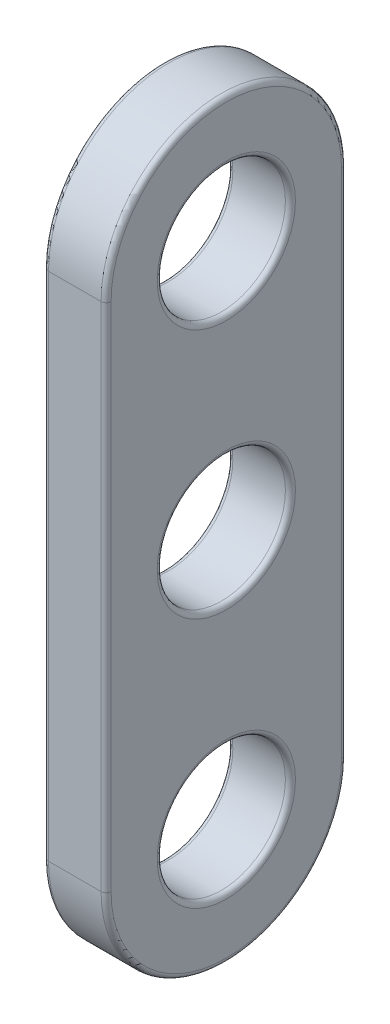
ISO-10303-21;
HEADER;
FILE_DESCRIPTION(('STEP AP214'),'2;1');
FILE_NAME('part.step','',(''),(''),'','','');
FILE_SCHEMA(('AUTOMOTIVE_DESIGN { 1 0 10303 214 1 1 1 1 }'));
ENDSEC;
DATA;
#1=APPLICATION_CONTEXT('core data for automotive mechanical design processes');
#2=APPLICATION_PROTOCOL_DEFINITION('international standard','automotive_design',2000,#1);
#3=PRODUCT_CONTEXT('',#1,'mechanical');
#4=PRODUCT('Part','Part','',(#3));
#5=PRODUCT_RELATED_PRODUCT_CATEGORY('part','',(#4));
#6=PRODUCT_DEFINITION_FORMATION('','',#4);
#7=PRODUCT_DEFINITION_CONTEXT('part definition',#1,'design');
#8=PRODUCT_DEFINITION('design','',#6,#7);
#9=PRODUCT_DEFINITION_SHAPE('','',#8);
#10=(LENGTH_UNIT() NAMED_UNIT(*) SI_UNIT(.MILLI.,.METRE.));
#11=(NAMED_UNIT(*) PLANE_ANGLE_UNIT() SI_UNIT($,.RADIAN.));
#12=(NAMED_UNIT(*) SI_UNIT($,.STERADIAN.) SOLID_ANGLE_UNIT());
#13=UNCERTAINTY_MEASURE_WITH_UNIT(LENGTH_MEASURE(1.E-05),#10,'distance_accuracy_value','');
#14=(GEOMETRIC_REPRESENTATION_CONTEXT(3) GLOBAL_UNCERTAINTY_ASSIGNED_CONTEXT((#13)) GLOBAL_UNIT_ASSIGNED_CONTEXT((#10,
#11,#12)) REPRESENTATION_CONTEXT('',''));
#15=CARTESIAN_POINT('',(0.,0.,0.));
#16=DIRECTION('',(0.,0.,1.));
#17=DIRECTION('',(1.,0.,0.));
#18=AXIS2_PLACEMENT_3D('',#15,#16,#17);
#19=CARTESIAN_POINT('',(-1.5875,-12.954,0.));
#20=DIRECTION('',(-1.,0.,0.));
#21=DIRECTION('',(0.,0.,1.));
#22=AXIS2_PLACEMENT_3D('',#19,#20,#21);
#23=CYLINDRICAL_SURFACE('',#22,6.096);
#24=DIRECTION('',(-1.,0.,0.));
#25=VECTOR('',#24,1.);
#26=CARTESIAN_POINT('',(1.5875,-12.954,6.096));
#27=LINE('',#26,#25);
#28=CARTESIAN_POINT('',(-1.3335,-12.954,6.096));
#29=VERTEX_POINT('',#28);
#30=CARTESIAN_POINT('',(1.3335,-12.954,6.096));
#31=VERTEX_POINT('',#30);
#32=EDGE_CURVE('E208',#29,#31,#27,.F.);
#33=ORIENTED_EDGE('',*,*,#32,.F.);
#34=CARTESIAN_POINT('',(-1.3335,-12.954,0.));
#35=DIRECTION('',(1.,0.,0.));
#36=DIRECTION('',(0.,0.,-1.));
#37=AXIS2_PLACEMENT_3D('',#34,#35,#36);
#38=CIRCLE('',#37,6.096);
#39=CARTESIAN_POINT('',(-1.3335,-12.954,-6.096));
#40=VERTEX_POINT('',#39);
#41=EDGE_CURVE('E179',#29,#40,#38,.T.);
#42=ORIENTED_EDGE('',*,*,#41,.T.);
#43=DIRECTION('',(-1.,0.,0.));
#44=VECTOR('',#43,1.);
#45=CARTESIAN_POINT('',(1.5875,-12.954,-6.096));
#46=LINE('',#45,#44);
#47=CARTESIAN_POINT('',(1.3335,-12.954,-6.096));
#48=VERTEX_POINT('',#47);
#49=EDGE_CURVE('E210',#48,#40,#46,.T.);
#50=ORIENTED_EDGE('',*,*,#49,.F.);
#51=CARTESIAN_POINT('',(1.3335,-12.954,0.));
#52=DIRECTION('',(1.,0.,0.));
#53=DIRECTION('',(0.,0.,-1.));
#54=AXIS2_PLACEMENT_3D('',#51,#52,#53);
#55=CIRCLE('',#54,6.096);
#56=EDGE_CURVE('E177',#48,#31,#55,.F.);
#57=ORIENTED_EDGE('',*,*,#56,.T.);
#58=EDGE_LOOP('',(#33,#42,#50,#57));
#59=FACE_BOUND('',#58,.T.);
#60=ADVANCED_FACE('F34',(#59),#23,.T.);
#61=CARTESIAN_POINT('',(1.5875,12.954,0.));
#62=DIRECTION('',(-1.,0.,0.));
#63=DIRECTION('',(0.,0.,1.));
#64=AXIS2_PLACEMENT_3D('',#61,#62,#63);
#65=CYLINDRICAL_SURFACE('',#64,6.096);
#66=DIRECTION('',(-1.,0.,0.));
#67=VECTOR('',#66,1.);
#68=CARTESIAN_POINT('',(1.5875,12.954,-6.096));
#69=LINE('',#68,#67);
#70=CARTESIAN_POINT('',(-1.3335,12.954,-6.096));
#71=VERTEX_POINT('',#70);
#72=CARTESIAN_POINT('',(1.3335,12.954,-6.096));
#73=VERTEX_POINT('',#72);
#74=EDGE_CURVE('E202',#71,#73,#69,.F.);
#75=ORIENTED_EDGE('',*,*,#74,.F.);
#76=CARTESIAN_POINT('',(-1.3335,12.954,0.));
#77=DIRECTION('',(1.,0.,0.));
#78=DIRECTION('',(0.,0.,-1.));
#79=AXIS2_PLACEMENT_3D('',#76,#77,#78);
#80=CIRCLE('',#79,6.096);
#81=CARTESIAN_POINT('',(-1.3335,12.954,6.096));
#82=VERTEX_POINT('',#81);
#83=EDGE_CURVE('E11',#71,#82,#80,.T.);
#84=ORIENTED_EDGE('',*,*,#83,.T.);
#85=DIRECTION('',(-1.,0.,0.));
#86=VECTOR('',#85,1.);
#87=CARTESIAN_POINT('',(1.5875,12.954,6.096));
#88=LINE('',#87,#86);
#89=CARTESIAN_POINT('',(1.3335,12.954,6.096));
#90=VERTEX_POINT('',#89);
#91=EDGE_CURVE('E191',#90,#82,#88,.T.);
#92=ORIENTED_EDGE('',*,*,#91,.F.);
#93=CARTESIAN_POINT('',(1.3335,12.954,0.));
#94=DIRECTION('',(1.,0.,0.));
#95=DIRECTION('',(0.,0.,-1.));
#96=AXIS2_PLACEMENT_3D('',#93,#94,#95);
#97=CIRCLE('',#96,6.096);
#98=EDGE_CURVE('E43',#90,#73,#97,.F.);
#99=ORIENTED_EDGE('',*,*,#98,.T.);
#100=EDGE_LOOP('',(#75,#84,#92,#99));
#101=FACE_BOUND('',#100,.T.);
#102=ADVANCED_FACE('F201',(#101),#65,.T.);
#103=CARTESIAN_POINT('',(1.5875,0.,0.));
#104=DIRECTION('',(1.,0.,0.));
#105=DIRECTION('',(0.,0.,-1.));
#106=AXIS2_PLACEMENT_3D('',#103,#104,#105);
#107=PLANE('',#106);
#108=CARTESIAN_POINT('',(1.5875,0.,0.));
#109=DIRECTION('',(1.,0.,0.));
#110=DIRECTION('',(0.,0.,-1.));
#111=AXIS2_PLACEMENT_3D('',#108,#109,#110);
#112=CIRCLE('',#111,3.5052);
#113=CARTESIAN_POINT('',(1.5875,0.,-3.5052));
#114=VERTEX_POINT('',#113);
#115=EDGE_CURVE('E137',#114,#114,#112,.F.);
#116=ORIENTED_EDGE('',*,*,#115,.T.);
#117=EDGE_LOOP('',(#116));
#118=FACE_BOUND('',#117,.T.);
#119=CARTESIAN_POINT('',(1.5875,-12.7,0.));
#120=DIRECTION('',(1.,0.,0.));
#121=DIRECTION('',(0.,0.,-1.));
#122=AXIS2_PLACEMENT_3D('',#119,#120,#121);
#123=CIRCLE('',#122,3.5052);
#124=CARTESIAN_POINT('',(1.5875,-12.7,-3.50520000000001));
#125=VERTEX_POINT('',#124);
#126=EDGE_CURVE('E134',#125,#125,#123,.F.);
#127=ORIENTED_EDGE('',*,*,#126,.T.);
#128=EDGE_LOOP('',(#127));
#129=FACE_BOUND('',#128,.T.);
#130=CARTESIAN_POINT('',(1.5875,12.7,0.));
#131=DIRECTION('',(1.,0.,0.));
#132=DIRECTION('',(0.,0.,-1.));
#133=AXIS2_PLACEMENT_3D('',#130,#131,#132);
#134=CIRCLE('',#133,3.5052);
#135=CARTESIAN_POINT('',(1.5875,12.7,-3.50520000000001));
#136=VERTEX_POINT('',#135);
#137=EDGE_CURVE('E128',#136,#136,#134,.F.);
#138=ORIENTED_EDGE('',*,*,#137,.T.);
#139=EDGE_LOOP('',(#138));
#140=FACE_BOUND('',#139,.T.);
#141=DIRECTION('',(0.,-1.,0.));
#142=VECTOR('',#141,1.);
#143=CARTESIAN_POINT('',(1.5875,-12.954,5.842));
#144=LINE('',#143,#142);
#145=CARTESIAN_POINT('',(1.5875,12.954,5.842));
#146=VERTEX_POINT('',#145);
#147=CARTESIAN_POINT('',(1.5875,-12.954,5.842));
#148=VERTEX_POINT('',#147);
#149=EDGE_CURVE('E120',#146,#148,#144,.T.);
#150=ORIENTED_EDGE('',*,*,#149,.T.);
#151=CARTESIAN_POINT('',(1.5875,-12.954,0.));
#152=DIRECTION('',(1.,0.,0.));
#153=DIRECTION('',(0.,0.,-1.));
#154=AXIS2_PLACEMENT_3D('',#151,#152,#153);
#155=CIRCLE('',#154,5.842);
#156=CARTESIAN_POINT('',(1.5875,-12.954,-5.842));
#157=VERTEX_POINT('',#156);
#158=EDGE_CURVE('E125',#148,#157,#155,.T.);
#159=ORIENTED_EDGE('',*,*,#158,.T.);
#160=DIRECTION('',(0.,1.,0.));
#161=VECTOR('',#160,1.);
#162=CARTESIAN_POINT('',(1.5875,12.954,-5.842));
#163=LINE('',#162,#161);
#164=CARTESIAN_POINT('',(1.5875,12.954,-5.842));
#165=VERTEX_POINT('',#164);
#166=EDGE_CURVE('E106',#157,#165,#163,.T.);
#167=ORIENTED_EDGE('',*,*,#166,.T.);
#168=CARTESIAN_POINT('',(1.5875,12.954,0.));
#169=DIRECTION('',(1.,0.,0.));
#170=DIRECTION('',(0.,0.,-1.));
#171=AXIS2_PLACEMENT_3D('',#168,#169,#170);
#172=CIRCLE('',#171,5.842);
#173=EDGE_CURVE('E114',#165,#146,#172,.T.);
#174=ORIENTED_EDGE('',*,*,#173,.T.);
#175=EDGE_LOOP('',(#150,#159,#167,#174));
#176=FACE_BOUND('',#175,.T.);
#177=ADVANCED_FACE('F123',(#118,#129,#140,#176),#107,.T.);
#178=CARTESIAN_POINT('',(-1.5875,0.,0.));
#179=DIRECTION('',(1.,0.,0.));
#180=DIRECTION('',(0.,0.,-1.));
#181=AXIS2_PLACEMENT_3D('',#178,#179,#180);
#182=PLANE('',#181);
#183=CARTESIAN_POINT('',(-1.5875,0.,0.));
#184=DIRECTION('',(1.,0.,0.));
#185=DIRECTION('',(0.,0.,-1.));
#186=AXIS2_PLACEMENT_3D('',#183,#184,#185);
#187=CIRCLE('',#186,3.5052);
#188=CARTESIAN_POINT('',(-1.5875,0.,-3.5052));
#189=VERTEX_POINT('',#188);
#190=EDGE_CURVE('E155',#189,#189,#187,.T.);
#191=ORIENTED_EDGE('',*,*,#190,.T.);
#192=EDGE_LOOP('',(#191));
#193=FACE_BOUND('',#192,.T.);
#194=CARTESIAN_POINT('',(-1.5875,-12.7,0.));
#195=DIRECTION('',(1.,0.,0.));
#196=DIRECTION('',(0.,0.,-1.));
#197=AXIS2_PLACEMENT_3D('',#194,#195,#196);
#198=CIRCLE('',#197,3.5052);
#199=CARTESIAN_POINT('',(-1.5875,-12.7,-3.50520000000001));
#200=VERTEX_POINT('',#199);
#201=EDGE_CURVE('E152',#200,#200,#198,.T.);
#202=ORIENTED_EDGE('',*,*,#201,.T.);
#203=EDGE_LOOP('',(#202));
#204=FACE_BOUND('',#203,.T.);
#205=CARTESIAN_POINT('',(-1.5875,12.7,0.));
#206=DIRECTION('',(1.,0.,0.));
#207=DIRECTION('',(0.,0.,-1.));
#208=AXIS2_PLACEMENT_3D('',#205,#206,#207);
#209=CIRCLE('',#208,3.5052);
#210=CARTESIAN_POINT('',(-1.5875,12.7,-3.50520000000001));
#211=VERTEX_POINT('',#210);
#212=EDGE_CURVE('E149',#211,#211,#209,.T.);
#213=ORIENTED_EDGE('',*,*,#212,.T.);
#214=EDGE_LOOP('',(#213));
#215=FACE_BOUND('',#214,.T.);
#216=DIRECTION('',(0.,1.,0.));
#217=VECTOR('',#216,1.);
#218=CARTESIAN_POINT('',(-1.5875,0.,-5.842));
#219=LINE('',#218,#217);
#220=CARTESIAN_POINT('',(-1.5875,12.954,-5.842));
#221=VERTEX_POINT('',#220);
#222=CARTESIAN_POINT('',(-1.5875,-12.954,-5.842));
#223=VERTEX_POINT('',#222);
#224=EDGE_CURVE('E144',#221,#223,#219,.F.);
#225=ORIENTED_EDGE('',*,*,#224,.T.);
#226=CARTESIAN_POINT('',(-1.5875,-12.954,0.));
#227=DIRECTION('',(1.,0.,0.));
#228=DIRECTION('',(0.,0.,-1.));
#229=AXIS2_PLACEMENT_3D('',#226,#227,#228);
#230=CIRCLE('',#229,5.842);
#231=CARTESIAN_POINT('',(-1.5875,-12.954,5.842));
#232=VERTEX_POINT('',#231);
#233=EDGE_CURVE('E147',#223,#232,#230,.F.);
#234=ORIENTED_EDGE('',*,*,#233,.T.);
#235=DIRECTION('',(0.,-1.,0.));
#236=VECTOR('',#235,1.);
#237=CARTESIAN_POINT('',(-1.5875,0.,5.842));
#238=LINE('',#237,#236);
#239=CARTESIAN_POINT('',(-1.5875,12.954,5.842));
#240=VERTEX_POINT('',#239);
#241=EDGE_CURVE('E142',#232,#240,#238,.F.);
#242=ORIENTED_EDGE('',*,*,#241,.T.);
#243=CARTESIAN_POINT('',(-1.5875,12.954,0.));
#244=DIRECTION('',(1.,0.,0.));
#245=DIRECTION('',(0.,0.,-1.));
#246=AXIS2_PLACEMENT_3D('',#243,#244,#245);
#247=CIRCLE('',#246,5.842);
#248=EDGE_CURVE('E140',#240,#221,#247,.F.);
#249=ORIENTED_EDGE('',*,*,#248,.T.);
#250=EDGE_LOOP('',(#225,#234,#242,#249));
#251=FACE_BOUND('',#250,.T.);
#252=ADVANCED_FACE('F251',(#193,#204,#215,#251),#182,.F.);
#253=CARTESIAN_POINT('',(1.5875,19.05,-6.096));
#254=DIRECTION('',(0.,0.,1.));
#255=DIRECTION('',(0.,-1.,0.));
#256=AXIS2_PLACEMENT_3D('',#253,#254,#255);
#257=PLANE('',#256);
#258=ORIENTED_EDGE('',*,*,#49,.T.);
#259=DIRECTION('',(0.,1.,0.));
#260=VECTOR('',#259,1.);
#261=CARTESIAN_POINT('',(-1.3335,19.05,-6.096));
#262=LINE('',#261,#260);
#263=EDGE_CURVE('E171',#40,#71,#262,.T.);
#264=ORIENTED_EDGE('',*,*,#263,.T.);
#265=ORIENTED_EDGE('',*,*,#74,.T.);
#266=DIRECTION('',(0.,1.,0.));
#267=VECTOR('',#266,1.);
#268=CARTESIAN_POINT('',(1.3335,-12.954,-6.096));
#269=LINE('',#268,#267);
#270=EDGE_CURVE('E108',#73,#48,#269,.F.);
#271=ORIENTED_EDGE('',*,*,#270,.T.);
#272=EDGE_LOOP('',(#258,#264,#265,#271));
#273=FACE_BOUND('',#272,.T.);
#274=ADVANCED_FACE('F205',(#273),#257,.F.);
#275=CARTESIAN_POINT('',(1.5875,19.05,6.096));
#276=DIRECTION('',(0.,0.,-1.));
#277=DIRECTION('',(0.,1.,0.));
#278=AXIS2_PLACEMENT_3D('',#275,#276,#277);
#279=PLANE('',#278);
#280=ORIENTED_EDGE('',*,*,#91,.T.);
#281=DIRECTION('',(0.,-1.,0.));
#282=VECTOR('',#281,1.);
#283=CARTESIAN_POINT('',(-1.3335,19.05,6.096));
#284=LINE('',#283,#282);
#285=EDGE_CURVE('E175',#82,#29,#284,.T.);
#286=ORIENTED_EDGE('',*,*,#285,.T.);
#287=ORIENTED_EDGE('',*,*,#32,.T.);
#288=DIRECTION('',(0.,-1.,0.));
#289=VECTOR('',#288,1.);
#290=CARTESIAN_POINT('',(1.3335,12.954,6.096));
#291=LINE('',#290,#289);
#292=EDGE_CURVE('E56',#31,#90,#291,.F.);
#293=ORIENTED_EDGE('',*,*,#292,.T.);
#294=EDGE_LOOP('',(#280,#286,#287,#293));
#295=FACE_BOUND('',#294,.T.);
#296=ADVANCED_FACE('F250',(#295),#279,.F.);
#297=CARTESIAN_POINT('',(1.5875,12.7,0.));
#298=DIRECTION('',(-1.,0.,0.));
#299=DIRECTION('',(0.,0.,1.));
#300=AXIS2_PLACEMENT_3D('',#297,#298,#299);
#301=CYLINDRICAL_SURFACE('',#300,3.2512);
#302=CARTESIAN_POINT('',(1.3335,12.7,0.));
#303=DIRECTION('',(1.,0.,0.));
#304=DIRECTION('',(0.,0.,-1.));
#305=AXIS2_PLACEMENT_3D('',#302,#303,#304);
#306=CIRCLE('',#305,3.2512);
#307=CARTESIAN_POINT('',(1.3335,12.7,-3.25120000000001));
#308=VERTEX_POINT('',#307);
#309=EDGE_CURVE('E167',#308,#308,#306,.T.);
#310=ORIENTED_EDGE('',*,*,#309,.T.);
#311=EDGE_LOOP('',(#310));
#312=FACE_BOUND('',#311,.T.);
#313=CARTESIAN_POINT('',(-1.3335,12.7,0.));
#314=DIRECTION('',(1.,0.,0.));
#315=DIRECTION('',(0.,0.,-1.));
#316=AXIS2_PLACEMENT_3D('',#313,#314,#315);
#317=CIRCLE('',#316,3.2512);
#318=CARTESIAN_POINT('',(-1.3335,12.7,-3.25120000000001));
#319=VERTEX_POINT('',#318);
#320=EDGE_CURVE('E164',#319,#319,#317,.F.);
#321=ORIENTED_EDGE('',*,*,#320,.T.);
#322=EDGE_LOOP('',(#321));
#323=FACE_BOUND('',#322,.T.);
#324=ADVANCED_FACE('F254',(#312,#323),#301,.F.);
#325=CARTESIAN_POINT('',(1.5875,-12.7,0.));
#326=DIRECTION('',(-1.,0.,0.));
#327=DIRECTION('',(0.,0.,1.));
#328=AXIS2_PLACEMENT_3D('',#325,#326,#327);
#329=CYLINDRICAL_SURFACE('',#328,3.2512);
#330=CARTESIAN_POINT('',(-1.3335,-12.7,0.));
#331=DIRECTION('',(1.,0.,0.));
#332=DIRECTION('',(0.,0.,-1.));
#333=AXIS2_PLACEMENT_3D('',#330,#331,#332);
#334=CIRCLE('',#333,3.2512);
#335=CARTESIAN_POINT('',(-1.3335,-12.7,-3.25120000000001));
#336=VERTEX_POINT('',#335);
#337=EDGE_CURVE('E161',#336,#336,#334,.F.);
#338=ORIENTED_EDGE('',*,*,#337,.T.);
#339=EDGE_LOOP('',(#338));
#340=FACE_BOUND('',#339,.T.);
#341=CARTESIAN_POINT('',(1.3335,-12.7,0.));
#342=DIRECTION('',(1.,0.,0.));
#343=DIRECTION('',(0.,0.,-1.));
#344=AXIS2_PLACEMENT_3D('',#341,#342,#343);
#345=CIRCLE('',#344,3.2512);
#346=CARTESIAN_POINT('',(1.3335,-12.7,-3.25120000000001));
#347=VERTEX_POINT('',#346);
#348=EDGE_CURVE('E158',#347,#347,#345,.T.);
#349=ORIENTED_EDGE('',*,*,#348,.T.);
#350=EDGE_LOOP('',(#349));
#351=FACE_BOUND('',#350,.T.);
#352=ADVANCED_FACE('F236',(#340,#351),#329,.F.);
#353=CARTESIAN_POINT('',(-1.5875,0.,0.));
#354=DIRECTION('',(1.,0.,0.));
#355=DIRECTION('',(0.,0.,-1.));
#356=AXIS2_PLACEMENT_3D('',#353,#354,#355);
#357=CYLINDRICAL_SURFACE('',#356,3.2512);
#358=CARTESIAN_POINT('',(1.3335,0.,0.));
#359=DIRECTION('',(1.,0.,0.));
#360=DIRECTION('',(0.,0.,-1.));
#361=AXIS2_PLACEMENT_3D('',#358,#359,#360);
#362=CIRCLE('',#361,3.2512);
#363=CARTESIAN_POINT('',(1.3335,0.,-3.2512));
#364=VERTEX_POINT('',#363);
#365=EDGE_CURVE('E121',#364,#364,#362,.T.);
#366=ORIENTED_EDGE('',*,*,#365,.T.);
#367=EDGE_LOOP('',(#366));
#368=FACE_BOUND('',#367,.T.);
#369=CARTESIAN_POINT('',(-1.3335,0.,0.));
#370=DIRECTION('',(1.,0.,0.));
#371=DIRECTION('',(0.,0.,-1.));
#372=AXIS2_PLACEMENT_3D('',#369,#370,#371);
#373=CIRCLE('',#372,3.2512);
#374=CARTESIAN_POINT('',(-1.3335,0.,-3.2512));
#375=VERTEX_POINT('',#374);
#376=EDGE_CURVE('E215',#375,#375,#373,.F.);
#377=ORIENTED_EDGE('',*,*,#376,.T.);
#378=EDGE_LOOP('',(#377));
#379=FACE_BOUND('',#378,.T.);
#380=ADVANCED_FACE('F221',(#368,#379),#357,.F.);
#381=CARTESIAN_POINT('',(1.3335,0.,0.));
#382=DIRECTION('',(1.,0.,0.));
#383=DIRECTION('',(0.,0.,-1.));
#384=AXIS2_PLACEMENT_3D('',#381,#382,#383);
#385=TOROIDAL_SURFACE('',#384,3.5052,0.254);
#386=ORIENTED_EDGE('',*,*,#115,.F.);
#387=EDGE_LOOP('',(#386));
#388=FACE_BOUND('',#387,.T.);
#389=ORIENTED_EDGE('',*,*,#365,.F.);
#390=EDGE_LOOP('',(#389));
#391=FACE_BOUND('',#390,.T.);
#392=ADVANCED_FACE('F224',(#388,#391),#385,.T.);
#393=CARTESIAN_POINT('',(-1.3335,0.,0.));
#394=DIRECTION('',(1.,0.,0.));
#395=DIRECTION('',(0.,0.,-1.));
#396=AXIS2_PLACEMENT_3D('',#393,#394,#395);
#397=TOROIDAL_SURFACE('',#396,3.5052,0.254);
#398=ORIENTED_EDGE('',*,*,#376,.F.);
#399=EDGE_LOOP('',(#398));
#400=FACE_BOUND('',#399,.T.);
#401=ORIENTED_EDGE('',*,*,#190,.F.);
#402=EDGE_LOOP('',(#401));
#403=FACE_BOUND('',#402,.T.);
#404=ADVANCED_FACE('F226',(#400,#403),#397,.T.);
#405=CARTESIAN_POINT('',(-1.3335,-12.7,0.));
#406=DIRECTION('',(1.,0.,0.));
#407=DIRECTION('',(0.,0.,-1.));
#408=AXIS2_PLACEMENT_3D('',#405,#406,#407);
#409=TOROIDAL_SURFACE('',#408,3.5052,0.254);
#410=ORIENTED_EDGE('',*,*,#337,.F.);
#411=EDGE_LOOP('',(#410));
#412=FACE_BOUND('',#411,.T.);
#413=ORIENTED_EDGE('',*,*,#201,.F.);
#414=EDGE_LOOP('',(#413));
#415=FACE_BOUND('',#414,.T.);
#416=ADVANCED_FACE('F233',(#412,#415),#409,.T.);
#417=CARTESIAN_POINT('',(1.3335,-12.7,0.));
#418=DIRECTION('',(1.,0.,0.));
#419=DIRECTION('',(0.,0.,-1.));
#420=AXIS2_PLACEMENT_3D('',#417,#418,#419);
#421=TOROIDAL_SURFACE('',#420,3.5052,0.254);
#422=ORIENTED_EDGE('',*,*,#126,.F.);
#423=EDGE_LOOP('',(#422));
#424=FACE_BOUND('',#423,.T.);
#425=ORIENTED_EDGE('',*,*,#348,.F.);
#426=EDGE_LOOP('',(#425));
#427=FACE_BOUND('',#426,.T.);
#428=ADVANCED_FACE('F272',(#424,#427),#421,.T.);
#429=CARTESIAN_POINT('',(1.3335,12.7,0.));
#430=DIRECTION('',(1.,0.,0.));
#431=DIRECTION('',(0.,0.,-1.));
#432=AXIS2_PLACEMENT_3D('',#429,#430,#431);
#433=TOROIDAL_SURFACE('',#432,3.5052,0.254);
#434=ORIENTED_EDGE('',*,*,#137,.F.);
#435=EDGE_LOOP('',(#434));
#436=FACE_BOUND('',#435,.T.);
#437=ORIENTED_EDGE('',*,*,#309,.F.);
#438=EDGE_LOOP('',(#437));
#439=FACE_BOUND('',#438,.T.);
#440=ADVANCED_FACE('F274',(#436,#439),#433,.T.);
#441=CARTESIAN_POINT('',(-1.3335,19.05,5.842));
#442=DIRECTION('',(0.,-1.,0.));
#443=DIRECTION('',(0.,0.,-1.));
#444=AXIS2_PLACEMENT_3D('',#441,#442,#443);
#445=CYLINDRICAL_SURFACE('',#444,0.254);
#446=CARTESIAN_POINT('',(-1.3335,12.954,5.842));
#447=DIRECTION('',(0.,1.,0.));
#448=DIRECTION('',(0.,0.,1.));
#449=AXIS2_PLACEMENT_3D('',#446,#447,#448);
#450=CIRCLE('',#449,0.254);
#451=EDGE_CURVE('E186',#240,#82,#450,.T.);
#452=ORIENTED_EDGE('',*,*,#451,.F.);
#453=ORIENTED_EDGE('',*,*,#241,.F.);
#454=CARTESIAN_POINT('',(-1.3335,-12.954,5.842));
#455=DIRECTION('',(0.,-1.,0.));
#456=DIRECTION('',(0.,0.,-1.));
#457=AXIS2_PLACEMENT_3D('',#454,#455,#456);
#458=CIRCLE('',#457,0.254);
#459=EDGE_CURVE('E189',#29,#232,#458,.T.);
#460=ORIENTED_EDGE('',*,*,#459,.F.);
#461=ORIENTED_EDGE('',*,*,#285,.F.);
#462=EDGE_LOOP('',(#452,#453,#460,#461));
#463=FACE_BOUND('',#462,.T.);
#464=ADVANCED_FACE('F281',(#463),#445,.T.);
#465=CARTESIAN_POINT('',(-1.3335,-12.954,0.));
#466=DIRECTION('',(1.,0.,0.));
#467=DIRECTION('',(0.,0.,-1.));
#468=AXIS2_PLACEMENT_3D('',#465,#466,#467);
#469=TOROIDAL_SURFACE('',#468,5.842,0.254);
#470=ORIENTED_EDGE('',*,*,#459,.T.);
#471=ORIENTED_EDGE('',*,*,#233,.F.);
#472=CARTESIAN_POINT('',(-1.3335,-12.954,-5.84200000000001));
#473=DIRECTION('',(0.,1.,0.));
#474=DIRECTION('',(0.,0.,1.));
#475=AXIS2_PLACEMENT_3D('',#472,#473,#474);
#476=CIRCLE('',#475,0.254);
#477=EDGE_CURVE('E184',#40,#223,#476,.T.);
#478=ORIENTED_EDGE('',*,*,#477,.F.);
#479=ORIENTED_EDGE('',*,*,#41,.F.);
#480=EDGE_LOOP('',(#470,#471,#478,#479));
#481=FACE_BOUND('',#480,.T.);
#482=ADVANCED_FACE('F295',(#481),#469,.T.);
#483=CARTESIAN_POINT('',(-1.3335,12.954,0.));
#484=DIRECTION('',(1.,0.,0.));
#485=DIRECTION('',(0.,0.,-1.));
#486=AXIS2_PLACEMENT_3D('',#483,#484,#485);
#487=TOROIDAL_SURFACE('',#486,5.842,0.254);
#488=ORIENTED_EDGE('',*,*,#451,.T.);
#489=ORIENTED_EDGE('',*,*,#83,.F.);
#490=CARTESIAN_POINT('',(-1.3335,12.954,-5.842));
#491=DIRECTION('',(0.,-1.,0.));
#492=DIRECTION('',(0.,0.,-1.));
#493=AXIS2_PLACEMENT_3D('',#490,#491,#492);
#494=CIRCLE('',#493,0.254);
#495=EDGE_CURVE('E182',#221,#71,#494,.T.);
#496=ORIENTED_EDGE('',*,*,#495,.F.);
#497=ORIENTED_EDGE('',*,*,#248,.F.);
#498=EDGE_LOOP('',(#488,#489,#496,#497));
#499=FACE_BOUND('',#498,.T.);
#500=ADVANCED_FACE('F291',(#499),#487,.T.);
#501=CARTESIAN_POINT('',(-1.3335,19.05,-5.842));
#502=DIRECTION('',(0.,1.,0.));
#503=DIRECTION('',(0.,0.,1.));
#504=AXIS2_PLACEMENT_3D('',#501,#502,#503);
#505=CYLINDRICAL_SURFACE('',#504,0.254);
#506=ORIENTED_EDGE('',*,*,#477,.T.);
#507=ORIENTED_EDGE('',*,*,#224,.F.);
#508=ORIENTED_EDGE('',*,*,#495,.T.);
#509=ORIENTED_EDGE('',*,*,#263,.F.);
#510=EDGE_LOOP('',(#506,#507,#508,#509));
#511=FACE_BOUND('',#510,.T.);
#512=ADVANCED_FACE('F288',(#511),#505,.T.);
#513=CARTESIAN_POINT('',(1.3335,0.,5.842));
#514=DIRECTION('',(0.,1.,0.));
#515=DIRECTION('',(0.,0.,1.));
#516=AXIS2_PLACEMENT_3D('',#513,#514,#515);
#517=CYLINDRICAL_SURFACE('',#516,0.254);
#518=CARTESIAN_POINT('',(1.3335,12.954,5.842));
#519=DIRECTION('',(0.,1.,0.));
#520=DIRECTION('',(0.,0.,1.));
#521=AXIS2_PLACEMENT_3D('',#518,#519,#520);
#522=CIRCLE('',#521,0.254);
#523=EDGE_CURVE('E117',#90,#146,#522,.T.);
#524=ORIENTED_EDGE('',*,*,#523,.F.);
#525=ORIENTED_EDGE('',*,*,#292,.F.);
#526=CARTESIAN_POINT('',(1.3335,-12.954,5.842));
#527=DIRECTION('',(0.,-1.,0.));
#528=DIRECTION('',(0.,0.,-1.));
#529=AXIS2_PLACEMENT_3D('',#526,#527,#528);
#530=CIRCLE('',#529,0.254);
#531=EDGE_CURVE('E38',#148,#31,#530,.T.);
#532=ORIENTED_EDGE('',*,*,#531,.F.);
#533=ORIENTED_EDGE('',*,*,#149,.F.);
#534=EDGE_LOOP('',(#524,#525,#532,#533));
#535=FACE_BOUND('',#534,.T.);
#536=ADVANCED_FACE('F199',(#535),#517,.T.);
#537=CARTESIAN_POINT('',(1.3335,-12.954,0.));
#538=DIRECTION('',(1.,0.,0.));
#539=DIRECTION('',(0.,0.,-1.));
#540=AXIS2_PLACEMENT_3D('',#537,#538,#539);
#541=TOROIDAL_SURFACE('',#540,5.842,0.254);
#542=ORIENTED_EDGE('',*,*,#531,.T.);
#543=ORIENTED_EDGE('',*,*,#56,.F.);
#544=CARTESIAN_POINT('',(1.3335,-12.954,-5.84200000000001));
#545=DIRECTION('',(0.,1.,0.));
#546=DIRECTION('',(0.,0.,1.));
#547=AXIS2_PLACEMENT_3D('',#544,#545,#546);
#548=CIRCLE('',#547,0.254);
#549=EDGE_CURVE('E111',#157,#48,#548,.T.);
#550=ORIENTED_EDGE('',*,*,#549,.F.);
#551=ORIENTED_EDGE('',*,*,#158,.F.);
#552=EDGE_LOOP('',(#542,#543,#550,#551));
#553=FACE_BOUND('',#552,.T.);
#554=ADVANCED_FACE('F197',(#553),#541,.T.);
#555=CARTESIAN_POINT('',(1.3335,12.954,0.));
#556=DIRECTION('',(1.,0.,0.));
#557=DIRECTION('',(0.,0.,-1.));
#558=AXIS2_PLACEMENT_3D('',#555,#556,#557);
#559=TOROIDAL_SURFACE('',#558,5.842,0.254);
#560=ORIENTED_EDGE('',*,*,#523,.T.);
#561=ORIENTED_EDGE('',*,*,#173,.F.);
#562=CARTESIAN_POINT('',(1.3335,12.954,-5.842));
#563=DIRECTION('',(0.,-1.,0.));
#564=DIRECTION('',(0.,0.,-1.));
#565=AXIS2_PLACEMENT_3D('',#562,#563,#564);
#566=CIRCLE('',#565,0.254);
#567=EDGE_CURVE('E102',#73,#165,#566,.T.);
#568=ORIENTED_EDGE('',*,*,#567,.F.);
#569=ORIENTED_EDGE('',*,*,#98,.F.);
#570=EDGE_LOOP('',(#560,#561,#568,#569));
#571=FACE_BOUND('',#570,.T.);
#572=ADVANCED_FACE('F115',(#571),#559,.T.);
#573=CARTESIAN_POINT('',(1.3335,0.,-5.842));
#574=DIRECTION('',(0.,-1.,0.));
#575=DIRECTION('',(0.,0.,-1.));
#576=AXIS2_PLACEMENT_3D('',#573,#574,#575);
#577=CYLINDRICAL_SURFACE('',#576,0.254);
#578=ORIENTED_EDGE('',*,*,#549,.T.);
#579=ORIENTED_EDGE('',*,*,#270,.F.);
#580=ORIENTED_EDGE('',*,*,#567,.T.);
#581=ORIENTED_EDGE('',*,*,#166,.F.);
#582=EDGE_LOOP('',(#578,#579,#580,#581));
#583=FACE_BOUND('',#582,.T.);
#584=ADVANCED_FACE('F104',(#583),#577,.T.);
#585=CARTESIAN_POINT('',(-1.3335,12.7,0.));
#586=DIRECTION('',(1.,0.,0.));
#587=DIRECTION('',(0.,0.,-1.));
#588=AXIS2_PLACEMENT_3D('',#585,#586,#587);
#589=TOROIDAL_SURFACE('',#588,3.5052,0.254);
#590=ORIENTED_EDGE('',*,*,#320,.F.);
#591=EDGE_LOOP('',(#590));
#592=FACE_BOUND('',#591,.T.);
#593=ORIENTED_EDGE('',*,*,#212,.F.);
#594=EDGE_LOOP('',(#593));
#595=FACE_BOUND('',#594,.T.);
#596=ADVANCED_FACE('F36',(#592,#595),#589,.T.);
#597=CLOSED_SHELL('',(#60,#102,#177,#252,#274,#296,#324,#352,#380,#392,#404,#416,#428,#440,#464,
#482,#500,#512,#536,#554,#572,#584,#596));
#598=MANIFOLD_SOLID_BREP('B2',#597);
#599=ADVANCED_BREP_SHAPE_REPRESENTATION('',(#18,#598),#14);
#600=SHAPE_DEFINITION_REPRESENTATION(#9,#599);
ENDSEC;
END-ISO-10303-21;
